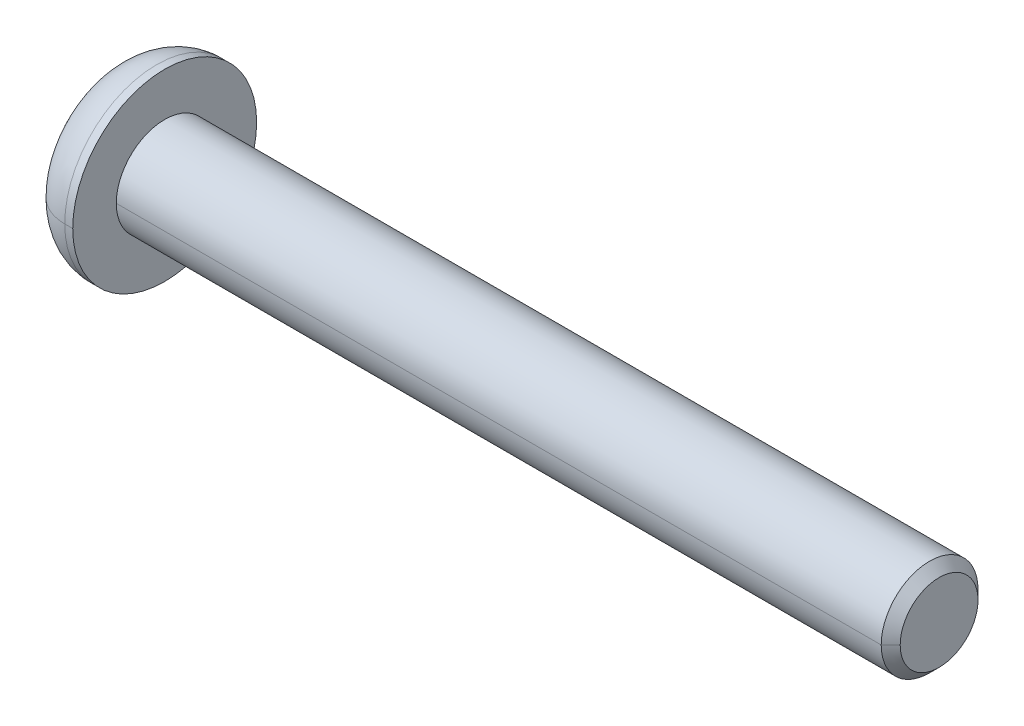
ISO-10303-21;
HEADER;
FILE_DESCRIPTION(('STEP AP214'),'2;1');
FILE_NAME('part.step','',(''),(''),'','','');
FILE_SCHEMA(('AUTOMOTIVE_DESIGN { 1 0 10303 214 1 1 1 1 }'));
ENDSEC;
DATA;
#1=APPLICATION_CONTEXT('core data for automotive mechanical design processes');
#2=APPLICATION_PROTOCOL_DEFINITION('international standard','automotive_design',2000,#1);
#3=PRODUCT_CONTEXT('',#1,'mechanical');
#4=PRODUCT('Part','Part','',(#3));
#5=PRODUCT_RELATED_PRODUCT_CATEGORY('part','',(#4));
#6=PRODUCT_DEFINITION_FORMATION('','',#4);
#7=PRODUCT_DEFINITION_CONTEXT('part definition',#1,'design');
#8=PRODUCT_DEFINITION('design','',#6,#7);
#9=PRODUCT_DEFINITION_SHAPE('','',#8);
#10=(LENGTH_UNIT() NAMED_UNIT(*) SI_UNIT(.MILLI.,.METRE.));
#11=(NAMED_UNIT(*) PLANE_ANGLE_UNIT() SI_UNIT($,.RADIAN.));
#12=(NAMED_UNIT(*) SI_UNIT($,.STERADIAN.) SOLID_ANGLE_UNIT());
#13=UNCERTAINTY_MEASURE_WITH_UNIT(LENGTH_MEASURE(1.E-05),#10,'distance_accuracy_value','');
#14=(GEOMETRIC_REPRESENTATION_CONTEXT(3) GLOBAL_UNCERTAINTY_ASSIGNED_CONTEXT((#13)) GLOBAL_UNIT_ASSIGNED_CONTEXT((#10,
#11,#12)) REPRESENTATION_CONTEXT('',''));
#15=CARTESIAN_POINT('',(0.,0.,0.));
#16=DIRECTION('',(0.,0.,1.));
#17=DIRECTION('',(1.,0.,0.));
#18=AXIS2_PLACEMENT_3D('',#15,#16,#17);
#19=CARTESIAN_POINT('',(39.5095,0.,0.));
#20=DIRECTION('',(-1.,0.,0.));
#21=DIRECTION('',(0.,-1.,0.));
#22=AXIS2_PLACEMENT_3D('',#19,#20,#21);
#23=CONICAL_SURFACE('',#22,2.5,0.7853981634);
#24=CARTESIAN_POINT('',(40.,0.,0.));
#25=DIRECTION('',(1.,0.,0.));
#26=DIRECTION('',(0.,0.,-1.));
#27=AXIS2_PLACEMENT_3D('',#24,#25,#26);
#28=CIRCLE('',#27,2.0095);
#29=CARTESIAN_POINT('',(40.,0.,-2.0095));
#30=VERTEX_POINT('',#29);
#31=CARTESIAN_POINT('',(39.9999999999987,0.,2.00949999999875));
#32=VERTEX_POINT('',#31);
#33=EDGE_CURVE('E11',#30,#32,#28,.T.);
#34=ORIENTED_EDGE('',*,*,#33,.F.);
#35=DIRECTION('',(-0.707106781184743,0.,-0.707106781188352));
#36=VECTOR('',#35,1.);
#37=CARTESIAN_POINT('',(39.9999999999987,0.,-2.00949999999875));
#38=LINE('',#37,#36);
#39=CARTESIAN_POINT('',(39.5095,0.,-2.5));
#40=VERTEX_POINT('',#39);
#41=EDGE_CURVE('E25',#30,#40,#38,.T.);
#42=ORIENTED_EDGE('',*,*,#41,.T.);
#43=CARTESIAN_POINT('',(39.5095,0.,0.));
#44=DIRECTION('',(1.,0.,0.));
#45=DIRECTION('',(0.,0.,-1.));
#46=AXIS2_PLACEMENT_3D('',#43,#44,#45);
#47=CIRCLE('',#46,2.5);
#48=CARTESIAN_POINT('',(39.5095,0.,2.5));
#49=VERTEX_POINT('',#48);
#50=EDGE_CURVE('E175',#40,#49,#47,.T.);
#51=ORIENTED_EDGE('',*,*,#50,.T.);
#52=DIRECTION('',(-0.707106781184743,0.,0.707106781188352));
#53=VECTOR('',#52,1.);
#54=CARTESIAN_POINT('',(39.9999999999987,0.,2.00949999999875));
#55=LINE('',#54,#53);
#56=EDGE_CURVE('E170',#32,#49,#55,.T.);
#57=ORIENTED_EDGE('',*,*,#56,.F.);
#58=EDGE_LOOP('',(#34,#42,#51,#57));
#59=FACE_BOUND('',#58,.T.);
#60=ADVANCED_FACE('F17',(#59),#23,.T.);
#61=CARTESIAN_POINT('',(39.5095,0.,0.));
#62=DIRECTION('',(-1.,0.,0.));
#63=DIRECTION('',(0.,1.,0.));
#64=AXIS2_PLACEMENT_3D('',#61,#62,#63);
#65=CONICAL_SURFACE('',#64,2.5,0.7853981634);
#66=CARTESIAN_POINT('',(39.5095,0.,0.));
#67=DIRECTION('',(1.,0.,0.));
#68=DIRECTION('',(0.,0.,-1.));
#69=AXIS2_PLACEMENT_3D('',#66,#67,#68);
#70=CIRCLE('',#69,2.5);
#71=EDGE_CURVE('E166',#49,#40,#70,.T.);
#72=ORIENTED_EDGE('',*,*,#71,.T.);
#73=ORIENTED_EDGE('',*,*,#41,.F.);
#74=CARTESIAN_POINT('',(40.,0.,0.));
#75=DIRECTION('',(1.,0.,0.));
#76=DIRECTION('',(0.,0.,-1.));
#77=AXIS2_PLACEMENT_3D('',#74,#75,#76);
#78=CIRCLE('',#77,2.0095);
#79=EDGE_CURVE('E161',#32,#30,#78,.T.);
#80=ORIENTED_EDGE('',*,*,#79,.F.);
#81=ORIENTED_EDGE('',*,*,#56,.T.);
#82=EDGE_LOOP('',(#72,#73,#80,#81));
#83=FACE_BOUND('',#82,.T.);
#84=ADVANCED_FACE('F189',(#83),#65,.T.);
#85=CARTESIAN_POINT('',(40.,2.0095,0.));
#86=DIRECTION('',(-1.,0.,0.));
#87=DIRECTION('',(0.,0.,1.));
#88=AXIS2_PLACEMENT_3D('',#85,#86,#87);
#89=PLANE('',#88);
#90=ORIENTED_EDGE('',*,*,#33,.T.);
#91=ORIENTED_EDGE('',*,*,#79,.T.);
#92=EDGE_LOOP('',(#90,#91));
#93=FACE_BOUND('',#92,.T.);
#94=ADVANCED_FACE('F217',(#93),#89,.F.);
#95=CARTESIAN_POINT('',(40.,0.,0.));
#96=DIRECTION('',(-1.,0.,0.));
#97=DIRECTION('',(0.,1.,0.));
#98=AXIS2_PLACEMENT_3D('',#95,#96,#97);
#99=CYLINDRICAL_SURFACE('',#98,2.5);
#100=CARTESIAN_POINT('',(0.,0.,0.));
#101=DIRECTION('',(1.,0.,0.));
#102=DIRECTION('',(0.,0.,-1.));
#103=AXIS2_PLACEMENT_3D('',#100,#101,#102);
#104=CIRCLE('',#103,2.5);
#105=CARTESIAN_POINT('',(0.,0.,2.5));
#106=VERTEX_POINT('',#105);
#107=CARTESIAN_POINT('',(0.,0.,-2.5));
#108=VERTEX_POINT('',#107);
#109=EDGE_CURVE('E157',#106,#108,#104,.T.);
#110=ORIENTED_EDGE('',*,*,#109,.T.);
#111=DIRECTION('',(-1.,0.,0.));
#112=VECTOR('',#111,1.);
#113=CARTESIAN_POINT('',(39.5095,0.,-2.5));
#114=LINE('',#113,#112);
#115=EDGE_CURVE('E152',#40,#108,#114,.T.);
#116=ORIENTED_EDGE('',*,*,#115,.F.);
#117=ORIENTED_EDGE('',*,*,#71,.F.);
#118=DIRECTION('',(-1.,0.,0.));
#119=VECTOR('',#118,1.);
#120=CARTESIAN_POINT('',(39.5095,0.,2.5));
#121=LINE('',#120,#119);
#122=EDGE_CURVE('E148',#49,#106,#121,.T.);
#123=ORIENTED_EDGE('',*,*,#122,.T.);
#124=EDGE_LOOP('',(#110,#116,#117,#123));
#125=FACE_BOUND('',#124,.T.);
#126=ADVANCED_FACE('F192',(#125),#99,.T.);
#127=CARTESIAN_POINT('',(40.,0.,0.));
#128=DIRECTION('',(-1.,0.,0.));
#129=DIRECTION('',(0.,-1.,0.));
#130=AXIS2_PLACEMENT_3D('',#127,#128,#129);
#131=CYLINDRICAL_SURFACE('',#130,2.5);
#132=ORIENTED_EDGE('',*,*,#50,.F.);
#133=ORIENTED_EDGE('',*,*,#115,.T.);
#134=CARTESIAN_POINT('',(0.,0.,0.));
#135=DIRECTION('',(1.,0.,0.));
#136=DIRECTION('',(0.,0.,-1.));
#137=AXIS2_PLACEMENT_3D('',#134,#135,#136);
#138=CIRCLE('',#137,2.5);
#139=EDGE_CURVE('E143',#108,#106,#138,.T.);
#140=ORIENTED_EDGE('',*,*,#139,.T.);
#141=ORIENTED_EDGE('',*,*,#122,.F.);
#142=EDGE_LOOP('',(#132,#133,#140,#141));
#143=FACE_BOUND('',#142,.T.);
#144=ADVANCED_FACE('F193',(#143),#131,.T.);
#145=CARTESIAN_POINT('',(0.,4.75,0.));
#146=DIRECTION('',(-1.,0.,0.));
#147=DIRECTION('',(0.,0.,1.));
#148=AXIS2_PLACEMENT_3D('',#145,#146,#147);
#149=PLANE('',#148);
#150=ORIENTED_EDGE('',*,*,#139,.F.);
#151=ORIENTED_EDGE('',*,*,#109,.F.);
#152=EDGE_LOOP('',(#150,#151));
#153=FACE_BOUND('',#152,.T.);
#154=CARTESIAN_POINT('',(0.,0.,0.));
#155=DIRECTION('',(1.,0.,0.));
#156=DIRECTION('',(0.,0.,-1.));
#157=AXIS2_PLACEMENT_3D('',#154,#155,#156);
#158=CIRCLE('',#157,4.75);
#159=CARTESIAN_POINT('',(0.,0.,-4.75));
#160=VERTEX_POINT('',#159);
#161=CARTESIAN_POINT('',(0.,0.,4.75));
#162=VERTEX_POINT('',#161);
#163=EDGE_CURVE('E139',#160,#162,#158,.T.);
#164=ORIENTED_EDGE('',*,*,#163,.T.);
#165=CARTESIAN_POINT('',(0.,0.,0.));
#166=DIRECTION('',(1.,0.,0.));
#167=DIRECTION('',(0.,0.,-1.));
#168=AXIS2_PLACEMENT_3D('',#165,#166,#167);
#169=CIRCLE('',#168,4.75);
#170=EDGE_CURVE('E135',#162,#160,#169,.T.);
#171=ORIENTED_EDGE('',*,*,#170,.T.);
#172=EDGE_LOOP('',(#164,#171));
#173=FACE_BOUND('',#172,.T.);
#174=ADVANCED_FACE('F197',(#153,#173),#149,.F.);
#175=CARTESIAN_POINT('',(40.,0.,0.));
#176=DIRECTION('',(-1.,0.,0.));
#177=DIRECTION('',(0.,1.,0.));
#178=AXIS2_PLACEMENT_3D('',#175,#176,#177);
#179=CYLINDRICAL_SURFACE('',#178,4.75);
#180=CARTESIAN_POINT('',(-0.412500000000003,0.,0.));
#181=DIRECTION('',(1.,0.,0.));
#182=DIRECTION('',(0.,0.,-1.));
#183=AXIS2_PLACEMENT_3D('',#180,#181,#182);
#184=CIRCLE('',#183,4.75);
#185=CARTESIAN_POINT('',(-0.412500000000001,0.,4.75));
#186=VERTEX_POINT('',#185);
#187=CARTESIAN_POINT('',(-0.412500000000003,0.,-4.75));
#188=VERTEX_POINT('',#187);
#189=EDGE_CURVE('E83',#186,#188,#184,.T.);
#190=ORIENTED_EDGE('',*,*,#189,.T.);
#191=DIRECTION('',(-1.,0.,0.));
#192=VECTOR('',#191,1.);
#193=CARTESIAN_POINT('',(0.,0.,-4.75));
#194=LINE('',#193,#192);
#195=EDGE_CURVE('E127',#160,#188,#194,.T.);
#196=ORIENTED_EDGE('',*,*,#195,.F.);
#197=ORIENTED_EDGE('',*,*,#170,.F.);
#198=DIRECTION('',(-1.,0.,0.));
#199=VECTOR('',#198,1.);
#200=CARTESIAN_POINT('',(0.,0.,4.75));
#201=LINE('',#200,#199);
#202=EDGE_CURVE('E123',#162,#186,#201,.T.);
#203=ORIENTED_EDGE('',*,*,#202,.T.);
#204=EDGE_LOOP('',(#190,#196,#197,#203));
#205=FACE_BOUND('',#204,.T.);
#206=ADVANCED_FACE('F200',(#205),#179,.T.);
#207=CARTESIAN_POINT('',(40.,0.,0.));
#208=DIRECTION('',(-1.,0.,0.));
#209=DIRECTION('',(0.,-1.,0.));
#210=AXIS2_PLACEMENT_3D('',#207,#208,#209);
#211=CYLINDRICAL_SURFACE('',#210,4.75);
#212=ORIENTED_EDGE('',*,*,#163,.F.);
#213=ORIENTED_EDGE('',*,*,#195,.T.);
#214=CARTESIAN_POINT('',(-0.412500000000003,0.,0.));
#215=DIRECTION('',(1.,0.,0.));
#216=DIRECTION('',(0.,0.,-1.));
#217=AXIS2_PLACEMENT_3D('',#214,#215,#216);
#218=CIRCLE('',#217,4.75);
#219=EDGE_CURVE('E120',#188,#186,#218,.T.);
#220=ORIENTED_EDGE('',*,*,#219,.T.);
#221=ORIENTED_EDGE('',*,*,#202,.F.);
#222=EDGE_LOOP('',(#212,#213,#220,#221));
#223=FACE_BOUND('',#222,.T.);
#224=ADVANCED_FACE('F104',(#223),#211,.T.);
#225=CARTESIAN_POINT('',(-0.412500000000154,0.,0.));
#226=DIRECTION('',(1.,0.,0.));
#227=DIRECTION('',(0.,-1.,0.));
#228=AXIS2_PLACEMENT_3D('',#225,#226,#227);
#229=TOROIDAL_SURFACE('',#228,2.4125,2.3375);
#230=ORIENTED_EDGE('',*,*,#219,.F.);
#231=CARTESIAN_POINT('',(-2.75000000000015,0.,-2.41249999999999));
#232=CARTESIAN_POINT('',(-2.75000081132017,0.,-2.45074729293482));
#233=CARTESIAN_POINT('',(-2.7490613000302,0.,-2.48899451683427));
#234=CARTESIAN_POINT('',(-2.74530745772929,0.,-2.56539686064639));
#235=CARTESIAN_POINT('',(-2.74249312671835,0.,-2.60355198055906));
#236=CARTESIAN_POINT('',(-2.73499547047448,0.,-2.67967815048162));
#237=CARTESIAN_POINT('',(-2.73031214524155,0.,-2.7176492004915));
#238=CARTESIAN_POINT('',(-2.71908803884411,0.,-2.7933157675873));
#239=CARTESIAN_POINT('',(-2.7125472576796,0.,-2.83101128467323));
#240=CARTESIAN_POINT('',(-2.69762392820581,0.,-2.90603597075216));
#241=CARTESIAN_POINT('',(-2.68924137989652,0.,-2.94336513974516));
#242=CARTESIAN_POINT('',(-2.67065472878828,0.,-3.01756720130258));
#243=CARTESIAN_POINT('',(-2.66045062598932,0.,-3.05444009386698));
#244=CARTESIAN_POINT('',(-2.63824544355907,0.,-3.12764077229761));
#245=CARTESIAN_POINT('',(-2.62624436392777,0.,-3.16396855816384));
#246=CARTESIAN_POINT('',(-2.60047414080317,0.,-3.23599150644478));
#247=CARTESIAN_POINT('',(-2.58670499730986,0.,-3.27168666885949));
#248=CARTESIAN_POINT('',(-2.55743181718072,0.,-3.34235837744728));
#249=CARTESIAN_POINT('',(-2.54192778054487,0.,-3.37733492362036));
#250=CARTESIAN_POINT('',(-2.50922216480754,0.,-3.44648513816619));
#251=CARTESIAN_POINT('',(-2.49202058570606,0.,-3.48065880653896));
#252=CARTESIAN_POINT('',(-2.45596132512282,0.,-3.54812093812256));
#253=CARTESIAN_POINT('',(-2.43710364364107,0.,-3.5814094013334));
#254=CARTESIAN_POINT('',(-2.39777760811052,0.,-3.64702092776989));
#255=CARTESIAN_POINT('',(-2.37730925406173,0.,-3.67934399099554));
#256=CARTESIAN_POINT('',(-2.33481118345299,0.,-3.74294684837108));
#257=CARTESIAN_POINT('',(-2.31278146689305,0.,-3.77422664252098));
#258=CARTESIAN_POINT('',(-2.26721374277928,0.,-3.83566760598114));
#259=CARTESIAN_POINT('',(-2.24367573522545,0.,-3.8658287752914));
#260=CARTESIAN_POINT('',(-2.19514813424566,0.,-3.92495982817363));
#261=CARTESIAN_POINT('',(-2.1701585408197,0.,-3.95392971174559));
#262=CARTESIAN_POINT('',(-2.11878797021506,0.,-4.01060840216421));
#263=CARTESIAN_POINT('',(-2.09240699303639,0.,-4.03831720901088));
#264=CARTESIAN_POINT('',(-2.03831720901105,0.,-4.09240699303622));
#265=CARTESIAN_POINT('',(-2.01060840216438,0.,-4.11878797021489));
#266=CARTESIAN_POINT('',(-1.95392971174575,0.,-4.17015854081953));
#267=CARTESIAN_POINT('',(-1.9249598281738,0.,-4.1951481342455));
#268=CARTESIAN_POINT('',(-1.86582877529157,0.,-4.24367573522529));
#269=CARTESIAN_POINT('',(-1.8356676059813,0.,-4.26721374277912));
#270=CARTESIAN_POINT('',(-1.77422664252115,0.,-4.31278146689289));
#271=CARTESIAN_POINT('',(-1.74294684837125,0.,-4.33481118345283));
#272=CARTESIAN_POINT('',(-1.67934399099571,0.,-4.37730925406156));
#273=CARTESIAN_POINT('',(-1.64702092777006,0.,-4.39777760811036));
#274=CARTESIAN_POINT('',(-1.58140940133357,0.,-4.4371036436409));
#275=CARTESIAN_POINT('',(-1.54812093812273,0.,-4.45596132512266));
#276=CARTESIAN_POINT('',(-1.48065880653913,0.,-4.49202058570589));
#277=CARTESIAN_POINT('',(-1.44648513816637,0.,-4.50922216480738));
#278=CARTESIAN_POINT('',(-1.37733492362053,0.,-4.54192778054471));
#279=CARTESIAN_POINT('',(-1.34235837744746,0.,-4.55743181718055));
#280=CARTESIAN_POINT('',(-1.27168666885967,0.,-4.5867049973097));
#281=CARTESIAN_POINT('',(-1.23599150644495,0.,-4.60047414080301));
#282=CARTESIAN_POINT('',(-1.16396855816401,0.,-4.62624436392761));
#283=CARTESIAN_POINT('',(-1.12764077229778,0.,-4.63824544355891));
#284=CARTESIAN_POINT('',(-1.05444009386715,0.,-4.66045062598916));
#285=CARTESIAN_POINT('',(-1.01756720130275,0.,-4.67065472878812));
#286=CARTESIAN_POINT('',(-0.943365139745337,0.,-4.68924137989637));
#287=CARTESIAN_POINT('',(-0.906035970752329,0.,-4.69762392820565));
#288=CARTESIAN_POINT('',(-0.831011284673399,0.,-4.71254725767945));
#289=CARTESIAN_POINT('',(-0.793315767587475,0.,-4.71908803884395));
#290=CARTESIAN_POINT('',(-0.71764920049167,0.,-4.73031214524139));
#291=CARTESIAN_POINT('',(-0.679678150481789,0.,-4.73499547047432));
#292=CARTESIAN_POINT('',(-0.603551980559236,0.,-4.74249312671819));
#293=CARTESIAN_POINT('',(-0.565396860646564,0.,-4.74530745772914));
#294=CARTESIAN_POINT('',(-0.488994516834444,0.,-4.74906130003004));
#295=CARTESIAN_POINT('',(-0.450747292934995,0.,-4.75000081132001));
#296=CARTESIAN_POINT('',(-0.412500000000165,0.,-4.75));
#297=B_SPLINE_CURVE_WITH_KNOTS('',3,(#231,#232,#233,#234,#235,#236,#237,#238,#239,#240,#241,
#242,#243,#244,#245,#246,#247,#248,#249,#250,#251,#252,#253,#254,#255,#256,#257,#258,#259,#260,
#261,#262,#263,#264,#265,#266,#267,#268,#269,#270,#271,#272,#273,#274,#275,#276,#277,#278,#279,
#280,#281,#282,#283,#284,#285,#286,#287,#288,#289,#290,#291,#292,#293,#294,#295,#296),
.UNSPECIFIED.,.F.,.F.,(4,2,2,2,2,2,2,2,2,2,2,2,2,2,2,2,2,2,2,2,2,2,2,2,2,2,2,2,2,2,2,2,4),(0.,
0.114730243344615,0.22946048668923,0.344190730033845,0.458920973378459,0.573651216723075,
0.688381460067689,0.803111703412304,0.917841946756919,1.03257219010153,1.14730243344615,
1.26203267679076,1.37676292013538,1.49149316347999,1.60622340682461,1.72095365016922,
1.83568389351384,1.95041413685845,2.06514438020307,2.17987462354768,2.2946048668923,
2.40933511023691,2.52406535358153,2.63879559692614,2.75352584027076,2.86825608361537,
2.98298632695999,3.0977165703046,3.21244681364922,3.32717705699383,3.44190730033845,
3.55663754368306,3.67136778702767),.UNSPECIFIED.);
#298=CARTESIAN_POINT('',(-2.75,0.,-2.4125));
#299=VERTEX_POINT('',#298);
#300=EDGE_CURVE('E73',#299,#188,#297,.T.);
#301=ORIENTED_EDGE('',*,*,#300,.F.);
#302=CARTESIAN_POINT('',(-2.75,0.,0.));
#303=DIRECTION('',(1.,0.,0.));
#304=DIRECTION('',(0.,0.,-1.));
#305=AXIS2_PLACEMENT_3D('',#302,#303,#304);
#306=CIRCLE('',#305,2.4125);
#307=CARTESIAN_POINT('',(-2.75000000000015,0.,2.4125));
#308=VERTEX_POINT('',#307);
#309=EDGE_CURVE('E65',#299,#308,#306,.T.);
#310=ORIENTED_EDGE('',*,*,#309,.T.);
#311=CARTESIAN_POINT('',(-2.75000000000015,0.,2.41249999999999));
#312=CARTESIAN_POINT('',(-2.75000081132017,0.,2.45074729293483));
#313=CARTESIAN_POINT('',(-2.7490613000302,0.,2.48899451683427));
#314=CARTESIAN_POINT('',(-2.74530745772929,0.,2.56539686064639));
#315=CARTESIAN_POINT('',(-2.74249312671835,0.,2.60355198055907));
#316=CARTESIAN_POINT('',(-2.73499547047448,0.,2.67967815048162));
#317=CARTESIAN_POINT('',(-2.73031214524155,0.,2.7176492004915));
#318=CARTESIAN_POINT('',(-2.71908803884411,0.,2.7933157675873));
#319=CARTESIAN_POINT('',(-2.7125472576796,0.,2.83101128467323));
#320=CARTESIAN_POINT('',(-2.69762392820581,0.,2.90603597075216));
#321=CARTESIAN_POINT('',(-2.68924137989652,0.,2.94336513974517));
#322=CARTESIAN_POINT('',(-2.67065472878828,0.,3.01756720130258));
#323=CARTESIAN_POINT('',(-2.66045062598932,0.,3.05444009386699));
#324=CARTESIAN_POINT('',(-2.63824544355907,0.,3.12764077229761));
#325=CARTESIAN_POINT('',(-2.62624436392777,0.,3.16396855816384));
#326=CARTESIAN_POINT('',(-2.60047414080317,0.,3.23599150644478));
#327=CARTESIAN_POINT('',(-2.58670499730986,0.,3.2716866688595));
#328=CARTESIAN_POINT('',(-2.55743181718072,0.,3.34235837744729));
#329=CARTESIAN_POINT('',(-2.54192778054487,0.,3.37733492362036));
#330=CARTESIAN_POINT('',(-2.50922216480754,0.,3.4464851381662));
#331=CARTESIAN_POINT('',(-2.49202058570605,0.,3.48065880653896));
#332=CARTESIAN_POINT('',(-2.45596132512282,0.,3.54812093812257));
#333=CARTESIAN_POINT('',(-2.43710364364107,0.,3.58140940133341));
#334=CARTESIAN_POINT('',(-2.39777760811052,0.,3.64702092776989));
#335=CARTESIAN_POINT('',(-2.37730925406172,0.,3.67934399099554));
#336=CARTESIAN_POINT('',(-2.33481118345299,0.,3.74294684837109));
#337=CARTESIAN_POINT('',(-2.31278146689305,0.,3.77422664252098));
#338=CARTESIAN_POINT('',(-2.26721374277928,0.,3.83566760598114));
#339=CARTESIAN_POINT('',(-2.24367573522545,0.,3.8658287752914));
#340=CARTESIAN_POINT('',(-2.19514813424566,0.,3.92495982817363));
#341=CARTESIAN_POINT('',(-2.17015854081969,0.,3.95392971174559));
#342=CARTESIAN_POINT('',(-2.11878797021506,0.,4.01060840216421));
#343=CARTESIAN_POINT('',(-2.09240699303638,0.,4.03831720901088));
#344=CARTESIAN_POINT('',(-2.03831720901104,0.,4.09240699303622));
#345=CARTESIAN_POINT('',(-2.01060840216438,0.,4.11878797021489));
#346=CARTESIAN_POINT('',(-1.95392971174575,0.,4.17015854081953));
#347=CARTESIAN_POINT('',(-1.92495982817379,0.,4.1951481342455));
#348=CARTESIAN_POINT('',(-1.86582877529157,0.,4.24367573522529));
#349=CARTESIAN_POINT('',(-1.8356676059813,0.,4.26721374277912));
#350=CARTESIAN_POINT('',(-1.77422664252114,0.,4.31278146689289));
#351=CARTESIAN_POINT('',(-1.74294684837125,0.,4.33481118345283));
#352=CARTESIAN_POINT('',(-1.67934399099571,0.,4.37730925406156));
#353=CARTESIAN_POINT('',(-1.64702092777006,0.,4.39777760811036));
#354=CARTESIAN_POINT('',(-1.58140940133357,0.,4.43710364364091));
#355=CARTESIAN_POINT('',(-1.54812093812273,0.,4.45596132512266));
#356=CARTESIAN_POINT('',(-1.48065880653913,0.,4.49202058570589));
#357=CARTESIAN_POINT('',(-1.44648513816636,0.,4.50922216480738));
#358=CARTESIAN_POINT('',(-1.37733492362053,0.,4.54192778054471));
#359=CARTESIAN_POINT('',(-1.34235837744745,0.,4.55743181718056));
#360=CARTESIAN_POINT('',(-1.27168666885966,0.,4.58670499730971));
#361=CARTESIAN_POINT('',(-1.23599150644495,0.,4.60047414080301));
#362=CARTESIAN_POINT('',(-1.16396855816401,0.,4.62624436392761));
#363=CARTESIAN_POINT('',(-1.12764077229778,0.,4.63824544355891));
#364=CARTESIAN_POINT('',(-1.05444009386715,0.,4.66045062598916));
#365=CARTESIAN_POINT('',(-1.01756720130275,0.,4.67065472878812));
#366=CARTESIAN_POINT('',(-0.943365139745335,0.,4.68924137989637));
#367=CARTESIAN_POINT('',(-0.906035970752328,0.,4.69762392820565));
#368=CARTESIAN_POINT('',(-0.831011284673397,0.,4.71254725767945));
#369=CARTESIAN_POINT('',(-0.793315767587473,0.,4.71908803884395));
#370=CARTESIAN_POINT('',(-0.717649200491668,0.,4.73031214524139));
#371=CARTESIAN_POINT('',(-0.679678150481787,0.,4.73499547047432));
#372=CARTESIAN_POINT('',(-0.603551980559234,0.,4.7424931267182));
#373=CARTESIAN_POINT('',(-0.565396860646562,0.,4.74530745772914));
#374=CARTESIAN_POINT('',(-0.488994516834442,0.,4.74906130003004));
#375=CARTESIAN_POINT('',(-0.450747292934993,0.,4.75000081132001));
#376=CARTESIAN_POINT('',(-0.412500000000163,0.,4.75));
#377=B_SPLINE_CURVE_WITH_KNOTS('',3,(#311,#312,#313,#314,#315,#316,#317,#318,#319,#320,#321,
#322,#323,#324,#325,#326,#327,#328,#329,#330,#331,#332,#333,#334,#335,#336,#337,#338,#339,#340,
#341,#342,#343,#344,#345,#346,#347,#348,#349,#350,#351,#352,#353,#354,#355,#356,#357,#358,#359,
#360,#361,#362,#363,#364,#365,#366,#367,#368,#369,#370,#371,#372,#373,#374,#375,#376),
.UNSPECIFIED.,.F.,.F.,(4,2,2,2,2,2,2,2,2,2,2,2,2,2,2,2,2,2,2,2,2,2,2,2,2,2,2,2,2,2,2,2,4),(0.,
0.114730243344615,0.22946048668923,0.344190730033844,0.458920973378459,0.573651216723074,
0.688381460067689,0.803111703412304,0.917841946756919,1.03257219010153,1.14730243344615,
1.26203267679076,1.37676292013538,1.49149316347999,1.60622340682461,1.72095365016922,
1.83568389351384,1.95041413685845,2.06514438020307,2.17987462354768,2.2946048668923,
2.40933511023691,2.52406535358153,2.63879559692614,2.75352584027076,2.86825608361537,
2.98298632695999,3.0977165703046,3.21244681364922,3.32717705699383,3.44190730033845,
3.55663754368306,3.67136778702767),.UNSPECIFIED.);
#378=EDGE_CURVE('E69',#308,#186,#377,.T.);
#379=ORIENTED_EDGE('',*,*,#378,.T.);
#380=EDGE_LOOP('',(#230,#301,#310,#379));
#381=FACE_BOUND('',#380,.T.);
#382=ADVANCED_FACE('F68',(#381),#229,.T.);
#383=CARTESIAN_POINT('',(-0.412500000000154,0.,0.));
#384=DIRECTION('',(1.,0.,0.));
#385=DIRECTION('',(0.,1.,0.));
#386=AXIS2_PLACEMENT_3D('',#383,#384,#385);
#387=TOROIDAL_SURFACE('',#386,2.4125,2.3375);
#388=CARTESIAN_POINT('',(-2.75,0.,0.));
#389=DIRECTION('',(1.,0.,0.));
#390=DIRECTION('',(0.,0.,-1.));
#391=AXIS2_PLACEMENT_3D('',#388,#389,#390);
#392=CIRCLE('',#391,2.4125);
#393=EDGE_CURVE('E82',#308,#299,#392,.T.);
#394=ORIENTED_EDGE('',*,*,#393,.T.);
#395=ORIENTED_EDGE('',*,*,#300,.T.);
#396=ORIENTED_EDGE('',*,*,#189,.F.);
#397=ORIENTED_EDGE('',*,*,#378,.F.);
#398=EDGE_LOOP('',(#394,#395,#396,#397));
#399=FACE_BOUND('',#398,.T.);
#400=ADVANCED_FACE('F81',(#399),#387,.T.);
#401=CARTESIAN_POINT('',(-2.75,0.,0.));
#402=DIRECTION('',(1.,0.,0.));
#403=DIRECTION('',(0.,0.,-1.));
#404=AXIS2_PLACEMENT_3D('',#401,#402,#403);
#405=PLANE('',#404);
#406=ORIENTED_EDGE('',*,*,#309,.F.);
#407=ORIENTED_EDGE('',*,*,#393,.F.);
#408=EDGE_LOOP('',(#406,#407));
#409=FACE_BOUND('',#408,.T.);
#410=ADVANCED_FACE('F86',(#409),#405,.F.);
#411=CLOSED_SHELL('',(#60,#84,#94,#126,#144,#174,#206,#224,#382,#400,#410));
#412=MANIFOLD_SOLID_BREP('B1',#411);
#413=ADVANCED_BREP_SHAPE_REPRESENTATION('',(#18,#412),#14);
#414=SHAPE_DEFINITION_REPRESENTATION(#9,#413);
ENDSEC;
END-ISO-10303-21;
